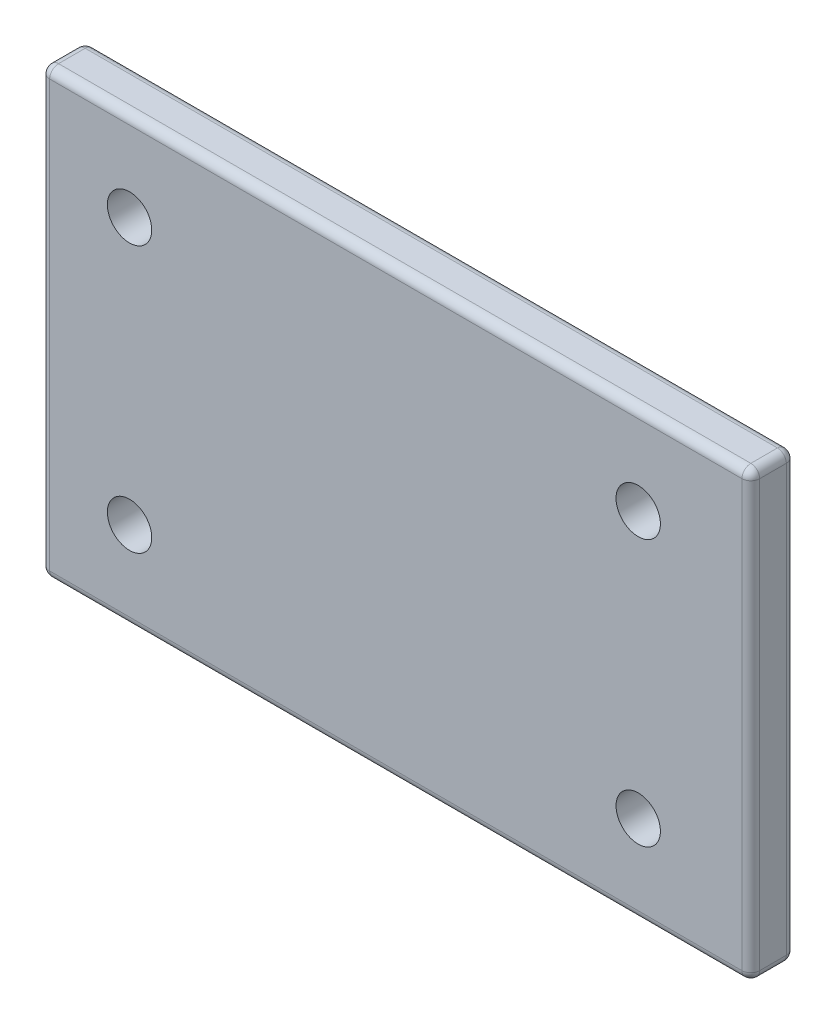
ISO-10303-21;
HEADER;
FILE_DESCRIPTION(('STEP AP214'),'2;1');
FILE_NAME('part.step','',(''),(''),'','','');
FILE_SCHEMA(('AUTOMOTIVE_DESIGN { 1 0 10303 214 1 1 1 1 }'));
ENDSEC;
DATA;
#1=APPLICATION_CONTEXT('core data for automotive mechanical design processes');
#2=APPLICATION_PROTOCOL_DEFINITION('international standard','automotive_design',2000,#1);
#3=PRODUCT_CONTEXT('',#1,'mechanical');
#4=PRODUCT('Part','Part','',(#3));
#5=PRODUCT_RELATED_PRODUCT_CATEGORY('part','',(#4));
#6=PRODUCT_DEFINITION_FORMATION('','',#4);
#7=PRODUCT_DEFINITION_CONTEXT('part definition',#1,'design');
#8=PRODUCT_DEFINITION('design','',#6,#7);
#9=PRODUCT_DEFINITION_SHAPE('','',#8);
#10=(LENGTH_UNIT() NAMED_UNIT(*) SI_UNIT(.MILLI.,.METRE.));
#11=(NAMED_UNIT(*) PLANE_ANGLE_UNIT() SI_UNIT($,.RADIAN.));
#12=(NAMED_UNIT(*) SI_UNIT($,.STERADIAN.) SOLID_ANGLE_UNIT());
#13=UNCERTAINTY_MEASURE_WITH_UNIT(LENGTH_MEASURE(1.E-05),#10,'distance_accuracy_value','');
#14=(GEOMETRIC_REPRESENTATION_CONTEXT(3) GLOBAL_UNCERTAINTY_ASSIGNED_CONTEXT((#13)) GLOBAL_UNIT_ASSIGNED_CONTEXT((#10,
#11,#12)) REPRESENTATION_CONTEXT('',''));
#15=CARTESIAN_POINT('',(0.,0.,0.));
#16=DIRECTION('',(0.,0.,1.));
#17=DIRECTION('',(1.,0.,0.));
#18=AXIS2_PLACEMENT_3D('',#15,#16,#17);
#19=CARTESIAN_POINT('',(-80.,-50.,10.));
#20=DIRECTION('',(1.,0.,0.));
#21=DIRECTION('',(0.,0.,-1.));
#22=AXIS2_PLACEMENT_3D('',#19,#20,#21);
#23=PLANE('',#22);
#24=DIRECTION('',(0.,0.,-1.));
#25=VECTOR('',#24,1.);
#26=CARTESIAN_POINT('',(-80.,48.,10.));
#27=LINE('',#26,#25);
#28=CARTESIAN_POINT('',(-80.,48.,8.));
#29=VERTEX_POINT('',#28);
#30=CARTESIAN_POINT('',(-80.,48.,2.));
#31=VERTEX_POINT('',#30);
#32=EDGE_CURVE('E179',#29,#31,#27,.T.);
#33=ORIENTED_EDGE('',*,*,#32,.T.);
#34=DIRECTION('',(0.,-1.,0.));
#35=VECTOR('',#34,1.);
#36=CARTESIAN_POINT('',(-80.,-50.,2.));
#37=LINE('',#36,#35);
#38=CARTESIAN_POINT('',(-80.,-48.,2.));
#39=VERTEX_POINT('',#38);
#40=EDGE_CURVE('E11',#31,#39,#37,.T.);
#41=ORIENTED_EDGE('',*,*,#40,.T.);
#42=DIRECTION('',(0.,0.,-1.));
#43=VECTOR('',#42,1.);
#44=CARTESIAN_POINT('',(-80.,-48.,10.));
#45=LINE('',#44,#43);
#46=CARTESIAN_POINT('',(-80.,-48.,8.));
#47=VERTEX_POINT('',#46);
#48=EDGE_CURVE('E212',#39,#47,#45,.F.);
#49=ORIENTED_EDGE('',*,*,#48,.T.);
#50=DIRECTION('',(0.,-1.,0.));
#51=VECTOR('',#50,1.);
#52=CARTESIAN_POINT('',(-80.,50.,8.));
#53=LINE('',#52,#51);
#54=EDGE_CURVE('E177',#47,#29,#53,.F.);
#55=ORIENTED_EDGE('',*,*,#54,.T.);
#56=EDGE_LOOP('',(#33,#41,#49,#55));
#57=FACE_BOUND('',#56,.T.);
#58=ADVANCED_FACE('F41',(#57),#23,.F.);
#59=CARTESIAN_POINT('',(80.,-50.,10.));
#60=DIRECTION('',(0.,1.,0.));
#61=DIRECTION('',(-1.,0.,0.));
#62=AXIS2_PLACEMENT_3D('',#59,#60,#61);
#63=PLANE('',#62);
#64=DIRECTION('',(1.,0.,0.));
#65=VECTOR('',#64,1.);
#66=CARTESIAN_POINT('',(-78.,-50.,8.));
#67=LINE('',#66,#65);
#68=CARTESIAN_POINT('',(78.,-50.,8.));
#69=VERTEX_POINT('',#68);
#70=CARTESIAN_POINT('',(-78.,-50.,8.));
#71=VERTEX_POINT('',#70);
#72=EDGE_CURVE('E198',#69,#71,#67,.F.);
#73=ORIENTED_EDGE('',*,*,#72,.T.);
#74=DIRECTION('',(0.,0.,-1.));
#75=VECTOR('',#74,1.);
#76=CARTESIAN_POINT('',(-78.,-50.,10.));
#77=LINE('',#76,#75);
#78=CARTESIAN_POINT('',(-78.,-50.,2.));
#79=VERTEX_POINT('',#78);
#80=EDGE_CURVE('E209',#71,#79,#77,.T.);
#81=ORIENTED_EDGE('',*,*,#80,.T.);
#82=DIRECTION('',(1.,0.,0.));
#83=VECTOR('',#82,1.);
#84=CARTESIAN_POINT('',(80.,-50.,2.));
#85=LINE('',#84,#83);
#86=CARTESIAN_POINT('',(78.,-50.,2.));
#87=VERTEX_POINT('',#86);
#88=EDGE_CURVE('E207',#79,#87,#85,.T.);
#89=ORIENTED_EDGE('',*,*,#88,.T.);
#90=DIRECTION('',(0.,0.,-1.));
#91=VECTOR('',#90,1.);
#92=CARTESIAN_POINT('',(78.,-50.,10.));
#93=LINE('',#92,#91);
#94=EDGE_CURVE('E205',#87,#69,#93,.F.);
#95=ORIENTED_EDGE('',*,*,#94,.T.);
#96=EDGE_LOOP('',(#73,#81,#89,#95));
#97=FACE_BOUND('',#96,.T.);
#98=ADVANCED_FACE('F286',(#97),#63,.F.);
#99=CARTESIAN_POINT('',(80.,-50.,10.));
#100=DIRECTION('',(-1.,0.,0.));
#101=DIRECTION('',(0.,0.,1.));
#102=AXIS2_PLACEMENT_3D('',#99,#100,#101);
#103=PLANE('',#102);
#104=DIRECTION('',(0.,1.,0.));
#105=VECTOR('',#104,1.);
#106=CARTESIAN_POINT('',(80.,-50.,8.));
#107=LINE('',#106,#105);
#108=CARTESIAN_POINT('',(80.,48.,8.));
#109=VERTEX_POINT('',#108);
#110=CARTESIAN_POINT('',(80.,-48.,8.));
#111=VERTEX_POINT('',#110);
#112=EDGE_CURVE('E184',#109,#111,#107,.F.);
#113=ORIENTED_EDGE('',*,*,#112,.T.);
#114=DIRECTION('',(0.,0.,-1.));
#115=VECTOR('',#114,1.);
#116=CARTESIAN_POINT('',(80.,-48.,10.));
#117=LINE('',#116,#115);
#118=CARTESIAN_POINT('',(80.,-48.,2.));
#119=VERTEX_POINT('',#118);
#120=EDGE_CURVE('E223',#111,#119,#117,.T.);
#121=ORIENTED_EDGE('',*,*,#120,.T.);
#122=DIRECTION('',(0.,1.,0.));
#123=VECTOR('',#122,1.);
#124=CARTESIAN_POINT('',(80.,-50.,2.));
#125=LINE('',#124,#123);
#126=CARTESIAN_POINT('',(80.,48.,2.));
#127=VERTEX_POINT('',#126);
#128=EDGE_CURVE('E189',#119,#127,#125,.T.);
#129=ORIENTED_EDGE('',*,*,#128,.T.);
#130=DIRECTION('',(0.,0.,-1.));
#131=VECTOR('',#130,1.);
#132=CARTESIAN_POINT('',(80.,48.,10.));
#133=LINE('',#132,#131);
#134=EDGE_CURVE('E187',#127,#109,#133,.F.);
#135=ORIENTED_EDGE('',*,*,#134,.T.);
#136=EDGE_LOOP('',(#113,#121,#129,#135));
#137=FACE_BOUND('',#136,.T.);
#138=ADVANCED_FACE('F320',(#137),#103,.F.);
#139=CARTESIAN_POINT('',(80.,50.,10.));
#140=DIRECTION('',(0.,-1.,0.));
#141=DIRECTION('',(1.,0.,0.));
#142=AXIS2_PLACEMENT_3D('',#139,#140,#141);
#143=PLANE('',#142);
#144=DIRECTION('',(0.,0.,-1.));
#145=VECTOR('',#144,1.);
#146=CARTESIAN_POINT('',(78.,50.,10.));
#147=LINE('',#146,#145);
#148=CARTESIAN_POINT('',(78.,50.,8.));
#149=VERTEX_POINT('',#148);
#150=CARTESIAN_POINT('',(78.,50.,2.));
#151=VERTEX_POINT('',#150);
#152=EDGE_CURVE('E194',#149,#151,#147,.T.);
#153=ORIENTED_EDGE('',*,*,#152,.T.);
#154=DIRECTION('',(-1.,0.,0.));
#155=VECTOR('',#154,1.);
#156=CARTESIAN_POINT('',(80.,50.,2.));
#157=LINE('',#156,#155);
#158=CARTESIAN_POINT('',(-78.,50.,2.));
#159=VERTEX_POINT('',#158);
#160=EDGE_CURVE('E249',#151,#159,#157,.T.);
#161=ORIENTED_EDGE('',*,*,#160,.T.);
#162=DIRECTION('',(0.,0.,-1.));
#163=VECTOR('',#162,1.);
#164=CARTESIAN_POINT('',(-78.,50.,10.));
#165=LINE('',#164,#163);
#166=CARTESIAN_POINT('',(-78.,50.,8.));
#167=VERTEX_POINT('',#166);
#168=EDGE_CURVE('E143',#159,#167,#165,.F.);
#169=ORIENTED_EDGE('',*,*,#168,.T.);
#170=DIRECTION('',(-1.,0.,0.));
#171=VECTOR('',#170,1.);
#172=CARTESIAN_POINT('',(80.,50.,8.));
#173=LINE('',#172,#171);
#174=EDGE_CURVE('E151',#167,#149,#173,.F.);
#175=ORIENTED_EDGE('',*,*,#174,.T.);
#176=EDGE_LOOP('',(#153,#161,#169,#175));
#177=FACE_BOUND('',#176,.T.);
#178=ADVANCED_FACE('F318',(#177),#143,.F.);
#179=CARTESIAN_POINT('',(0.,0.,10.));
#180=DIRECTION('',(0.,0.,1.));
#181=DIRECTION('',(1.,0.,0.));
#182=AXIS2_PLACEMENT_3D('',#179,#180,#181);
#183=PLANE('',#182);
#184=CARTESIAN_POINT('',(-60.,-30.,10.));
#185=DIRECTION('',(0.,0.,1.));
#186=DIRECTION('',(-1.,0.,0.));
#187=AXIS2_PLACEMENT_3D('',#184,#185,#186);
#188=CIRCLE('',#187,5.);
#189=CARTESIAN_POINT('',(-65.,-30.,10.));
#190=VERTEX_POINT('',#189);
#191=EDGE_CURVE('E577',#190,#190,#188,.T.);
#192=ORIENTED_EDGE('',*,*,#191,.F.);
#193=EDGE_LOOP('',(#192));
#194=FACE_BOUND('',#193,.T.);
#195=CARTESIAN_POINT('',(54.6247616156238,-30.,10.));
#196=DIRECTION('',(0.,0.,1.));
#197=DIRECTION('',(1.,0.,0.));
#198=AXIS2_PLACEMENT_3D('',#195,#196,#197);
#199=CIRCLE('',#198,5.);
#200=CARTESIAN_POINT('',(59.6247616156238,-30.,10.));
#201=VERTEX_POINT('',#200);
#202=EDGE_CURVE('E581',#201,#201,#199,.T.);
#203=ORIENTED_EDGE('',*,*,#202,.F.);
#204=EDGE_LOOP('',(#203));
#205=FACE_BOUND('',#204,.T.);
#206=CARTESIAN_POINT('',(54.6247616156238,30.,10.));
#207=DIRECTION('',(0.,0.,1.));
#208=DIRECTION('',(-1.,0.,0.));
#209=AXIS2_PLACEMENT_3D('',#206,#207,#208);
#210=CIRCLE('',#209,5.00000000000001);
#211=CARTESIAN_POINT('',(49.6247616156238,30.,10.));
#212=VERTEX_POINT('',#211);
#213=EDGE_CURVE('E590',#212,#212,#210,.T.);
#214=ORIENTED_EDGE('',*,*,#213,.F.);
#215=EDGE_LOOP('',(#214));
#216=FACE_BOUND('',#215,.T.);
#217=CARTESIAN_POINT('',(-60.,30.,10.));
#218=DIRECTION('',(0.,0.,1.));
#219=DIRECTION('',(1.,0.,0.));
#220=AXIS2_PLACEMENT_3D('',#217,#218,#219);
#221=CIRCLE('',#220,5.00000000000001);
#222=CARTESIAN_POINT('',(-55.,30.,10.));
#223=VERTEX_POINT('',#222);
#224=EDGE_CURVE('E171',#223,#223,#221,.T.);
#225=ORIENTED_EDGE('',*,*,#224,.F.);
#226=EDGE_LOOP('',(#225));
#227=FACE_BOUND('',#226,.T.);
#228=DIRECTION('',(0.,-1.,0.));
#229=VECTOR('',#228,1.);
#230=CARTESIAN_POINT('',(-78.,-50.,10.));
#231=LINE('',#230,#229);
#232=CARTESIAN_POINT('',(-78.,48.,10.));
#233=VERTEX_POINT('',#232);
#234=CARTESIAN_POINT('',(-78.,-48.,10.));
#235=VERTEX_POINT('',#234);
#236=EDGE_CURVE('E136',#233,#235,#231,.T.);
#237=ORIENTED_EDGE('',*,*,#236,.T.);
#238=DIRECTION('',(1.,0.,0.));
#239=VECTOR('',#238,1.);
#240=CARTESIAN_POINT('',(78.,-48.,10.));
#241=LINE('',#240,#239);
#242=CARTESIAN_POINT('',(78.,-48.,10.));
#243=VERTEX_POINT('',#242);
#244=EDGE_CURVE('E225',#235,#243,#241,.T.);
#245=ORIENTED_EDGE('',*,*,#244,.T.);
#246=DIRECTION('',(0.,1.,0.));
#247=VECTOR('',#246,1.);
#248=CARTESIAN_POINT('',(78.,48.,10.));
#249=LINE('',#248,#247);
#250=CARTESIAN_POINT('',(78.,48.,10.));
#251=VERTEX_POINT('',#250);
#252=EDGE_CURVE('E139',#243,#251,#249,.T.);
#253=ORIENTED_EDGE('',*,*,#252,.T.);
#254=DIRECTION('',(-1.,0.,0.));
#255=VECTOR('',#254,1.);
#256=CARTESIAN_POINT('',(-80.,48.,10.));
#257=LINE('',#256,#255);
#258=EDGE_CURVE('E132',#251,#233,#257,.T.);
#259=ORIENTED_EDGE('',*,*,#258,.T.);
#260=EDGE_LOOP('',(#237,#245,#253,#259));
#261=FACE_BOUND('',#260,.T.);
#262=ADVANCED_FACE('F134',(#194,#205,#216,#227,#261),#183,.T.);
#263=CARTESIAN_POINT('',(0.,0.,0.));
#264=DIRECTION('',(0.,0.,1.));
#265=DIRECTION('',(1.,0.,0.));
#266=AXIS2_PLACEMENT_3D('',#263,#264,#265);
#267=PLANE('',#266);
#268=CARTESIAN_POINT('',(-60.,-30.,0.));
#269=DIRECTION('',(0.,0.,1.));
#270=DIRECTION('',(-1.,0.,0.));
#271=AXIS2_PLACEMENT_3D('',#268,#269,#270);
#272=CIRCLE('',#271,5.);
#273=CARTESIAN_POINT('',(-65.,-30.,0.));
#274=VERTEX_POINT('',#273);
#275=EDGE_CURVE('E163',#274,#274,#272,.T.);
#276=ORIENTED_EDGE('',*,*,#275,.T.);
#277=EDGE_LOOP('',(#276));
#278=FACE_BOUND('',#277,.T.);
#279=CARTESIAN_POINT('',(54.6247616156238,-30.,0.));
#280=DIRECTION('',(0.,0.,1.));
#281=DIRECTION('',(1.,0.,0.));
#282=AXIS2_PLACEMENT_3D('',#279,#280,#281);
#283=CIRCLE('',#282,5.);
#284=CARTESIAN_POINT('',(59.6247616156238,-30.,0.));
#285=VERTEX_POINT('',#284);
#286=EDGE_CURVE('E578',#285,#285,#283,.T.);
#287=ORIENTED_EDGE('',*,*,#286,.T.);
#288=EDGE_LOOP('',(#287));
#289=FACE_BOUND('',#288,.T.);
#290=CARTESIAN_POINT('',(54.6247616156238,30.,0.));
#291=DIRECTION('',(0.,0.,1.));
#292=DIRECTION('',(-1.,0.,0.));
#293=AXIS2_PLACEMENT_3D('',#290,#291,#292);
#294=CIRCLE('',#293,5.00000000000001);
#295=CARTESIAN_POINT('',(49.6247616156238,30.,0.));
#296=VERTEX_POINT('',#295);
#297=EDGE_CURVE('E587',#296,#296,#294,.T.);
#298=ORIENTED_EDGE('',*,*,#297,.T.);
#299=EDGE_LOOP('',(#298));
#300=FACE_BOUND('',#299,.T.);
#301=CARTESIAN_POINT('',(-60.,30.,0.));
#302=DIRECTION('',(0.,0.,1.));
#303=DIRECTION('',(1.,0.,0.));
#304=AXIS2_PLACEMENT_3D('',#301,#302,#303);
#305=CIRCLE('',#304,5.00000000000001);
#306=CARTESIAN_POINT('',(-55.,30.,0.));
#307=VERTEX_POINT('',#306);
#308=EDGE_CURVE('E168',#307,#307,#305,.T.);
#309=ORIENTED_EDGE('',*,*,#308,.T.);
#310=EDGE_LOOP('',(#309));
#311=FACE_BOUND('',#310,.T.);
#312=DIRECTION('',(0.,-1.,0.));
#313=VECTOR('',#312,1.);
#314=CARTESIAN_POINT('',(-78.,0.,0.));
#315=LINE('',#314,#313);
#316=CARTESIAN_POINT('',(-78.,-48.,0.));
#317=VERTEX_POINT('',#316);
#318=CARTESIAN_POINT('',(-78.,48.,0.));
#319=VERTEX_POINT('',#318);
#320=EDGE_CURVE('E251',#317,#319,#315,.F.);
#321=ORIENTED_EDGE('',*,*,#320,.T.);
#322=DIRECTION('',(-1.,0.,0.));
#323=VECTOR('',#322,1.);
#324=CARTESIAN_POINT('',(0.,48.,0.));
#325=LINE('',#324,#323);
#326=CARTESIAN_POINT('',(78.,48.,0.));
#327=VERTEX_POINT('',#326);
#328=EDGE_CURVE('E253',#319,#327,#325,.F.);
#329=ORIENTED_EDGE('',*,*,#328,.T.);
#330=DIRECTION('',(0.,1.,0.));
#331=VECTOR('',#330,1.);
#332=CARTESIAN_POINT('',(78.,0.,0.));
#333=LINE('',#332,#331);
#334=CARTESIAN_POINT('',(78.,-48.,0.));
#335=VERTEX_POINT('',#334);
#336=EDGE_CURVE('E192',#327,#335,#333,.F.);
#337=ORIENTED_EDGE('',*,*,#336,.T.);
#338=DIRECTION('',(1.,0.,0.));
#339=VECTOR('',#338,1.);
#340=CARTESIAN_POINT('',(0.,-48.,0.));
#341=LINE('',#340,#339);
#342=EDGE_CURVE('E220',#335,#317,#341,.F.);
#343=ORIENTED_EDGE('',*,*,#342,.T.);
#344=EDGE_LOOP('',(#321,#329,#337,#343));
#345=FACE_BOUND('',#344,.T.);
#346=ADVANCED_FACE('F304',(#278,#289,#300,#311,#345),#267,.F.);
#347=CARTESIAN_POINT('',(-60.,30.,0.));
#348=DIRECTION('',(0.,0.,1.));
#349=DIRECTION('',(1.,0.,0.));
#350=AXIS2_PLACEMENT_3D('',#347,#348,#349);
#351=CYLINDRICAL_SURFACE('',#350,5.00000000000001);
#352=ORIENTED_EDGE('',*,*,#308,.F.);
#353=EDGE_LOOP('',(#352));
#354=FACE_BOUND('',#353,.T.);
#355=ORIENTED_EDGE('',*,*,#224,.T.);
#356=EDGE_LOOP('',(#355));
#357=FACE_BOUND('',#356,.T.);
#358=ADVANCED_FACE('F426',(#354,#357),#351,.F.);
#359=CARTESIAN_POINT('',(54.6247616156238,30.,0.));
#360=DIRECTION('',(0.,0.,1.));
#361=DIRECTION('',(1.,0.,0.));
#362=AXIS2_PLACEMENT_3D('',#359,#360,#361);
#363=CYLINDRICAL_SURFACE('',#362,5.00000000000001);
#364=ORIENTED_EDGE('',*,*,#297,.F.);
#365=EDGE_LOOP('',(#364));
#366=FACE_BOUND('',#365,.T.);
#367=ORIENTED_EDGE('',*,*,#213,.T.);
#368=EDGE_LOOP('',(#367));
#369=FACE_BOUND('',#368,.T.);
#370=ADVANCED_FACE('F442',(#366,#369),#363,.F.);
#371=CARTESIAN_POINT('',(54.6247616156238,-30.,0.));
#372=DIRECTION('',(0.,0.,1.));
#373=DIRECTION('',(1.,0.,0.));
#374=AXIS2_PLACEMENT_3D('',#371,#372,#373);
#375=CYLINDRICAL_SURFACE('',#374,5.);
#376=ORIENTED_EDGE('',*,*,#286,.F.);
#377=EDGE_LOOP('',(#376));
#378=FACE_BOUND('',#377,.T.);
#379=ORIENTED_EDGE('',*,*,#202,.T.);
#380=EDGE_LOOP('',(#379));
#381=FACE_BOUND('',#380,.T.);
#382=ADVANCED_FACE('F452',(#378,#381),#375,.F.);
#383=CARTESIAN_POINT('',(-60.,-30.,0.));
#384=DIRECTION('',(0.,0.,1.));
#385=DIRECTION('',(1.,0.,0.));
#386=AXIS2_PLACEMENT_3D('',#383,#384,#385);
#387=CYLINDRICAL_SURFACE('',#386,5.);
#388=ORIENTED_EDGE('',*,*,#275,.F.);
#389=EDGE_LOOP('',(#388));
#390=FACE_BOUND('',#389,.T.);
#391=ORIENTED_EDGE('',*,*,#191,.T.);
#392=EDGE_LOOP('',(#391));
#393=FACE_BOUND('',#392,.T.);
#394=ADVANCED_FACE('F348',(#390,#393),#387,.F.);
#395=CARTESIAN_POINT('',(-78.,0.,8.));
#396=DIRECTION('',(0.,1.,0.));
#397=DIRECTION('',(0.,0.,1.));
#398=AXIS2_PLACEMENT_3D('',#395,#396,#397);
#399=CYLINDRICAL_SURFACE('',#398,2.);
#400=ORIENTED_EDGE('',*,*,#54,.F.);
#401=CARTESIAN_POINT('',(-78.,-48.,8.));
#402=DIRECTION('',(0.,1.,0.));
#403=DIRECTION('',(0.,0.,1.));
#404=AXIS2_PLACEMENT_3D('',#401,#402,#403);
#405=CIRCLE('',#404,2.);
#406=EDGE_CURVE('E167',#47,#235,#405,.T.);
#407=ORIENTED_EDGE('',*,*,#406,.T.);
#408=ORIENTED_EDGE('',*,*,#236,.F.);
#409=CARTESIAN_POINT('',(-78.,48.,8.));
#410=DIRECTION('',(0.,1.,0.));
#411=DIRECTION('',(0.,0.,1.));
#412=AXIS2_PLACEMENT_3D('',#409,#410,#411);
#413=CIRCLE('',#412,2.);
#414=EDGE_CURVE('E158',#29,#233,#413,.T.);
#415=ORIENTED_EDGE('',*,*,#414,.F.);
#416=EDGE_LOOP('',(#400,#407,#408,#415));
#417=FACE_BOUND('',#416,.T.);
#418=ADVANCED_FACE('F165',(#417),#399,.T.);
#419=CARTESIAN_POINT('',(-78.,48.,10.));
#420=DIRECTION('',(0.,0.,-1.));
#421=DIRECTION('',(-1.,0.,0.));
#422=AXIS2_PLACEMENT_3D('',#419,#420,#421);
#423=CYLINDRICAL_SURFACE('',#422,2.);
#424=ORIENTED_EDGE('',*,*,#168,.F.);
#425=CARTESIAN_POINT('',(-78.,48.,2.));
#426=DIRECTION('',(0.,0.,-1.));
#427=DIRECTION('',(-1.,0.,0.));
#428=AXIS2_PLACEMENT_3D('',#425,#426,#427);
#429=CIRCLE('',#428,2.);
#430=EDGE_CURVE('E64',#159,#31,#429,.F.);
#431=ORIENTED_EDGE('',*,*,#430,.T.);
#432=ORIENTED_EDGE('',*,*,#32,.F.);
#433=CARTESIAN_POINT('',(-78.,48.,8.));
#434=DIRECTION('',(0.,0.,1.));
#435=DIRECTION('',(1.,0.,0.));
#436=AXIS2_PLACEMENT_3D('',#433,#434,#435);
#437=CIRCLE('',#436,2.);
#438=EDGE_CURVE('E154',#167,#29,#437,.T.);
#439=ORIENTED_EDGE('',*,*,#438,.F.);
#440=EDGE_LOOP('',(#424,#431,#432,#439));
#441=FACE_BOUND('',#440,.T.);
#442=ADVANCED_FACE('F294',(#441),#423,.T.);
#443=CARTESIAN_POINT('',(-78.,48.,8.));
#444=DIRECTION('',(-1.,0.,0.));
#445=DIRECTION('',(0.,-1.,0.));
#446=AXIS2_PLACEMENT_3D('',#443,#444,#445);
#447=SPHERICAL_SURFACE('',#446,2.);
#448=ORIENTED_EDGE('',*,*,#438,.T.);
#449=ORIENTED_EDGE('',*,*,#414,.T.);
#450=CARTESIAN_POINT('',(-78.,48.,8.));
#451=DIRECTION('',(-1.,0.,0.));
#452=DIRECTION('',(0.,0.,1.));
#453=AXIS2_PLACEMENT_3D('',#450,#451,#452);
#454=CIRCLE('',#453,2.);
#455=EDGE_CURVE('E147',#167,#233,#454,.F.);
#456=ORIENTED_EDGE('',*,*,#455,.F.);
#457=EDGE_LOOP('',(#448,#449,#456));
#458=FACE_BOUND('',#457,.T.);
#459=ADVANCED_FACE('F159',(#458),#447,.T.);
#460=CARTESIAN_POINT('',(0.,48.,8.));
#461=DIRECTION('',(1.,0.,0.));
#462=DIRECTION('',(0.,1.,0.));
#463=AXIS2_PLACEMENT_3D('',#460,#461,#462);
#464=CYLINDRICAL_SURFACE('',#463,2.);
#465=ORIENTED_EDGE('',*,*,#258,.F.);
#466=CARTESIAN_POINT('',(78.,48.,8.));
#467=DIRECTION('',(1.,0.,0.));
#468=DIRECTION('',(0.,1.,0.));
#469=AXIS2_PLACEMENT_3D('',#466,#467,#468);
#470=CIRCLE('',#469,2.);
#471=EDGE_CURVE('E180',#251,#149,#470,.F.);
#472=ORIENTED_EDGE('',*,*,#471,.T.);
#473=ORIENTED_EDGE('',*,*,#174,.F.);
#474=ORIENTED_EDGE('',*,*,#455,.T.);
#475=EDGE_LOOP('',(#465,#472,#473,#474));
#476=FACE_BOUND('',#475,.T.);
#477=ADVANCED_FACE('F149',(#476),#464,.T.);
#478=CARTESIAN_POINT('',(78.,-50.,2.));
#479=DIRECTION('',(0.,1.,0.));
#480=DIRECTION('',(0.,0.,1.));
#481=AXIS2_PLACEMENT_3D('',#478,#479,#480);
#482=CYLINDRICAL_SURFACE('',#481,2.);
#483=ORIENTED_EDGE('',*,*,#336,.F.);
#484=CARTESIAN_POINT('',(78.,48.,2.));
#485=DIRECTION('',(0.,1.,0.));
#486=DIRECTION('',(0.,0.,1.));
#487=AXIS2_PLACEMENT_3D('',#484,#485,#486);
#488=CIRCLE('',#487,2.);
#489=EDGE_CURVE('E247',#327,#127,#488,.F.);
#490=ORIENTED_EDGE('',*,*,#489,.T.);
#491=ORIENTED_EDGE('',*,*,#128,.F.);
#492=CARTESIAN_POINT('',(78.,-48.,2.));
#493=DIRECTION('',(0.,1.,0.));
#494=DIRECTION('',(0.,0.,1.));
#495=AXIS2_PLACEMENT_3D('',#492,#493,#494);
#496=CIRCLE('',#495,2.);
#497=EDGE_CURVE('E215',#119,#335,#496,.T.);
#498=ORIENTED_EDGE('',*,*,#497,.T.);
#499=EDGE_LOOP('',(#483,#490,#491,#498));
#500=FACE_BOUND('',#499,.T.);
#501=ADVANCED_FACE('F307',(#500),#482,.T.);
#502=CARTESIAN_POINT('',(78.,48.,10.));
#503=DIRECTION('',(0.,0.,-1.));
#504=DIRECTION('',(-1.,0.,0.));
#505=AXIS2_PLACEMENT_3D('',#502,#503,#504);
#506=CYLINDRICAL_SURFACE('',#505,2.);
#507=ORIENTED_EDGE('',*,*,#134,.F.);
#508=CARTESIAN_POINT('',(78.,48.,2.));
#509=DIRECTION('',(0.,0.,-1.));
#510=DIRECTION('',(-1.,0.,0.));
#511=AXIS2_PLACEMENT_3D('',#508,#509,#510);
#512=CIRCLE('',#511,2.);
#513=EDGE_CURVE('E227',#127,#151,#512,.F.);
#514=ORIENTED_EDGE('',*,*,#513,.T.);
#515=ORIENTED_EDGE('',*,*,#152,.F.);
#516=CARTESIAN_POINT('',(78.,48.,8.));
#517=DIRECTION('',(0.,0.,1.));
#518=DIRECTION('',(1.,0.,0.));
#519=AXIS2_PLACEMENT_3D('',#516,#517,#518);
#520=CIRCLE('',#519,2.);
#521=EDGE_CURVE('E155',#109,#149,#520,.T.);
#522=ORIENTED_EDGE('',*,*,#521,.F.);
#523=EDGE_LOOP('',(#507,#514,#515,#522));
#524=FACE_BOUND('',#523,.T.);
#525=ADVANCED_FACE('F316',(#524),#506,.T.);
#526=CARTESIAN_POINT('',(78.,0.,8.));
#527=DIRECTION('',(0.,-1.,0.));
#528=DIRECTION('',(0.,0.,-1.));
#529=AXIS2_PLACEMENT_3D('',#526,#527,#528);
#530=CYLINDRICAL_SURFACE('',#529,2.);
#531=ORIENTED_EDGE('',*,*,#252,.F.);
#532=CARTESIAN_POINT('',(78.,-48.,8.));
#533=DIRECTION('',(0.,-1.,0.));
#534=DIRECTION('',(0.,0.,-1.));
#535=AXIS2_PLACEMENT_3D('',#532,#533,#534);
#536=CIRCLE('',#535,2.);
#537=EDGE_CURVE('E218',#243,#111,#536,.F.);
#538=ORIENTED_EDGE('',*,*,#537,.T.);
#539=ORIENTED_EDGE('',*,*,#112,.F.);
#540=CARTESIAN_POINT('',(78.,48.,8.));
#541=DIRECTION('',(0.,1.,0.));
#542=DIRECTION('',(0.,0.,1.));
#543=AXIS2_PLACEMENT_3D('',#540,#541,#542);
#544=CIRCLE('',#543,2.);
#545=EDGE_CURVE('E199',#251,#109,#544,.T.);
#546=ORIENTED_EDGE('',*,*,#545,.F.);
#547=EDGE_LOOP('',(#531,#538,#539,#546));
#548=FACE_BOUND('',#547,.T.);
#549=ADVANCED_FACE('F353',(#548),#530,.T.);
#550=CARTESIAN_POINT('',(78.,48.,8.));
#551=DIRECTION('',(-1.,0.,0.));
#552=DIRECTION('',(0.,0.,1.));
#553=AXIS2_PLACEMENT_3D('',#550,#551,#552);
#554=SPHERICAL_SURFACE('',#553,2.);
#555=ORIENTED_EDGE('',*,*,#521,.T.);
#556=ORIENTED_EDGE('',*,*,#471,.F.);
#557=ORIENTED_EDGE('',*,*,#545,.T.);
#558=EDGE_LOOP('',(#555,#556,#557));
#559=FACE_BOUND('',#558,.T.);
#560=ADVANCED_FACE('F349',(#559),#554,.T.);
#561=CARTESIAN_POINT('',(78.,-48.,8.));
#562=DIRECTION('',(0.,1.,0.));
#563=DIRECTION('',(-1.,0.,0.));
#564=AXIS2_PLACEMENT_3D('',#561,#562,#563);
#565=SPHERICAL_SURFACE('',#564,2.);
#566=CARTESIAN_POINT('',(78.,-48.,8.));
#567=DIRECTION('',(-1.,0.,0.));
#568=DIRECTION('',(0.,0.,1.));
#569=AXIS2_PLACEMENT_3D('',#566,#567,#568);
#570=CIRCLE('',#569,2.);
#571=EDGE_CURVE('E240',#69,#243,#570,.T.);
#572=ORIENTED_EDGE('',*,*,#571,.F.);
#573=CARTESIAN_POINT('',(78.,-48.,8.));
#574=DIRECTION('',(0.,0.,-1.));
#575=DIRECTION('',(-1.,0.,0.));
#576=AXIS2_PLACEMENT_3D('',#573,#574,#575);
#577=CIRCLE('',#576,2.);
#578=EDGE_CURVE('E202',#111,#69,#577,.T.);
#579=ORIENTED_EDGE('',*,*,#578,.F.);
#580=ORIENTED_EDGE('',*,*,#537,.F.);
#581=EDGE_LOOP('',(#572,#579,#580));
#582=FACE_BOUND('',#581,.T.);
#583=ADVANCED_FACE('F352',(#582),#565,.T.);
#584=CARTESIAN_POINT('',(78.,-48.,10.));
#585=DIRECTION('',(0.,0.,-1.));
#586=DIRECTION('',(-1.,0.,0.));
#587=AXIS2_PLACEMENT_3D('',#584,#585,#586);
#588=CYLINDRICAL_SURFACE('',#587,2.);
#589=ORIENTED_EDGE('',*,*,#578,.T.);
#590=ORIENTED_EDGE('',*,*,#94,.F.);
#591=CARTESIAN_POINT('',(78.,-48.,2.));
#592=DIRECTION('',(0.,0.,-1.));
#593=DIRECTION('',(-1.,0.,0.));
#594=AXIS2_PLACEMENT_3D('',#591,#592,#593);
#595=CIRCLE('',#594,2.);
#596=EDGE_CURVE('E237',#119,#87,#595,.T.);
#597=ORIENTED_EDGE('',*,*,#596,.F.);
#598=ORIENTED_EDGE('',*,*,#120,.F.);
#599=EDGE_LOOP('',(#589,#590,#597,#598));
#600=FACE_BOUND('',#599,.T.);
#601=ADVANCED_FACE('F373',(#600),#588,.T.);
#602=CARTESIAN_POINT('',(0.,-48.,8.));
#603=DIRECTION('',(-1.,0.,0.));
#604=DIRECTION('',(0.,-1.,0.));
#605=AXIS2_PLACEMENT_3D('',#602,#603,#604);
#606=CYLINDRICAL_SURFACE('',#605,2.);
#607=ORIENTED_EDGE('',*,*,#571,.T.);
#608=ORIENTED_EDGE('',*,*,#244,.F.);
#609=CARTESIAN_POINT('',(-78.,-48.,8.));
#610=DIRECTION('',(-1.,0.,0.));
#611=DIRECTION('',(0.,0.,1.));
#612=AXIS2_PLACEMENT_3D('',#609,#610,#611);
#613=CIRCLE('',#612,2.);
#614=EDGE_CURVE('E234',#71,#235,#613,.T.);
#615=ORIENTED_EDGE('',*,*,#614,.F.);
#616=ORIENTED_EDGE('',*,*,#72,.F.);
#617=EDGE_LOOP('',(#607,#608,#615,#616));
#618=FACE_BOUND('',#617,.T.);
#619=ADVANCED_FACE('F291',(#618),#606,.T.);
#620=CARTESIAN_POINT('',(78.,-48.,2.));
#621=DIRECTION('',(0.,1.,0.));
#622=DIRECTION('',(-1.,0.,0.));
#623=AXIS2_PLACEMENT_3D('',#620,#621,#622);
#624=SPHERICAL_SURFACE('',#623,2.);
#625=ORIENTED_EDGE('',*,*,#497,.F.);
#626=ORIENTED_EDGE('',*,*,#596,.T.);
#627=CARTESIAN_POINT('',(78.,-48.,2.));
#628=DIRECTION('',(-1.,0.,0.));
#629=DIRECTION('',(0.,0.,1.));
#630=AXIS2_PLACEMENT_3D('',#627,#628,#629);
#631=CIRCLE('',#630,2.);
#632=EDGE_CURVE('E231',#335,#87,#631,.T.);
#633=ORIENTED_EDGE('',*,*,#632,.F.);
#634=EDGE_LOOP('',(#625,#626,#633));
#635=FACE_BOUND('',#634,.T.);
#636=ADVANCED_FACE('F367',(#635),#624,.T.);
#637=CARTESIAN_POINT('',(-78.,-48.,8.));
#638=DIRECTION('',(0.,1.,0.));
#639=DIRECTION('',(-1.,0.,0.));
#640=AXIS2_PLACEMENT_3D('',#637,#638,#639);
#641=SPHERICAL_SURFACE('',#640,2.);
#642=ORIENTED_EDGE('',*,*,#614,.T.);
#643=ORIENTED_EDGE('',*,*,#406,.F.);
#644=CARTESIAN_POINT('',(-78.,-48.,8.));
#645=DIRECTION('',(0.,0.,-1.));
#646=DIRECTION('',(-1.,0.,0.));
#647=AXIS2_PLACEMENT_3D('',#644,#645,#646);
#648=CIRCLE('',#647,2.);
#649=EDGE_CURVE('E228',#71,#47,#648,.T.);
#650=ORIENTED_EDGE('',*,*,#649,.F.);
#651=EDGE_LOOP('',(#642,#643,#650));
#652=FACE_BOUND('',#651,.T.);
#653=ADVANCED_FACE('F293',(#652),#641,.T.);
#654=CARTESIAN_POINT('',(80.,-48.,2.));
#655=DIRECTION('',(1.,0.,0.));
#656=DIRECTION('',(0.,1.,0.));
#657=AXIS2_PLACEMENT_3D('',#654,#655,#656);
#658=CYLINDRICAL_SURFACE('',#657,2.);
#659=ORIENTED_EDGE('',*,*,#88,.F.);
#660=CARTESIAN_POINT('',(-78.,-48.,2.));
#661=DIRECTION('',(1.,0.,0.));
#662=DIRECTION('',(0.,1.,0.));
#663=AXIS2_PLACEMENT_3D('',#660,#661,#662);
#664=CIRCLE('',#663,2.);
#665=EDGE_CURVE('E50',#79,#317,#664,.T.);
#666=ORIENTED_EDGE('',*,*,#665,.T.);
#667=ORIENTED_EDGE('',*,*,#342,.F.);
#668=ORIENTED_EDGE('',*,*,#632,.T.);
#669=EDGE_LOOP('',(#659,#666,#667,#668));
#670=FACE_BOUND('',#669,.T.);
#671=ADVANCED_FACE('F281',(#670),#658,.T.);
#672=CARTESIAN_POINT('',(-78.,-48.,10.));
#673=DIRECTION('',(0.,0.,-1.));
#674=DIRECTION('',(-1.,0.,0.));
#675=AXIS2_PLACEMENT_3D('',#672,#673,#674);
#676=CYLINDRICAL_SURFACE('',#675,2.);
#677=ORIENTED_EDGE('',*,*,#48,.F.);
#678=CARTESIAN_POINT('',(-78.,-48.,2.));
#679=DIRECTION('',(0.,0.,-1.));
#680=DIRECTION('',(-1.,0.,0.));
#681=AXIS2_PLACEMENT_3D('',#678,#679,#680);
#682=CIRCLE('',#681,2.);
#683=EDGE_CURVE('E256',#39,#79,#682,.F.);
#684=ORIENTED_EDGE('',*,*,#683,.T.);
#685=ORIENTED_EDGE('',*,*,#80,.F.);
#686=ORIENTED_EDGE('',*,*,#649,.T.);
#687=EDGE_LOOP('',(#677,#684,#685,#686));
#688=FACE_BOUND('',#687,.T.);
#689=ADVANCED_FACE('F279',(#688),#676,.T.);
#690=CARTESIAN_POINT('',(-78.,-48.,2.));
#691=DIRECTION('',(0.,0.,1.));
#692=DIRECTION('',(1.,0.,0.));
#693=AXIS2_PLACEMENT_3D('',#690,#691,#692);
#694=SPHERICAL_SURFACE('',#693,2.);
#695=ORIENTED_EDGE('',*,*,#665,.F.);
#696=ORIENTED_EDGE('',*,*,#683,.F.);
#697=CARTESIAN_POINT('',(-78.,-48.,2.));
#698=DIRECTION('',(0.,1.,0.));
#699=DIRECTION('',(0.,0.,1.));
#700=AXIS2_PLACEMENT_3D('',#697,#698,#699);
#701=CIRCLE('',#700,2.);
#702=EDGE_CURVE('E45',#317,#39,#701,.T.);
#703=ORIENTED_EDGE('',*,*,#702,.F.);
#704=EDGE_LOOP('',(#695,#696,#703));
#705=FACE_BOUND('',#704,.T.);
#706=ADVANCED_FACE('F43',(#705),#694,.T.);
#707=CARTESIAN_POINT('',(-78.,-50.,2.));
#708=DIRECTION('',(0.,-1.,0.));
#709=DIRECTION('',(0.,0.,-1.));
#710=AXIS2_PLACEMENT_3D('',#707,#708,#709);
#711=CYLINDRICAL_SURFACE('',#710,2.);
#712=ORIENTED_EDGE('',*,*,#702,.T.);
#713=ORIENTED_EDGE('',*,*,#40,.F.);
#714=CARTESIAN_POINT('',(-78.,48.,2.));
#715=DIRECTION('',(0.,1.,0.));
#716=DIRECTION('',(0.,0.,1.));
#717=AXIS2_PLACEMENT_3D('',#714,#715,#716);
#718=CIRCLE('',#717,2.);
#719=EDGE_CURVE('E263',#319,#31,#718,.T.);
#720=ORIENTED_EDGE('',*,*,#719,.F.);
#721=ORIENTED_EDGE('',*,*,#320,.F.);
#722=EDGE_LOOP('',(#712,#713,#720,#721));
#723=FACE_BOUND('',#722,.T.);
#724=ADVANCED_FACE('F272',(#723),#711,.T.);
#725=CARTESIAN_POINT('',(-78.,48.,2.));
#726=DIRECTION('',(0.,0.,1.));
#727=DIRECTION('',(1.,0.,0.));
#728=AXIS2_PLACEMENT_3D('',#725,#726,#727);
#729=SPHERICAL_SURFACE('',#728,2.);
#730=ORIENTED_EDGE('',*,*,#719,.T.);
#731=ORIENTED_EDGE('',*,*,#430,.F.);
#732=CARTESIAN_POINT('',(-78.,48.,2.));
#733=DIRECTION('',(1.,0.,0.));
#734=DIRECTION('',(0.,0.,-1.));
#735=AXIS2_PLACEMENT_3D('',#732,#733,#734);
#736=CIRCLE('',#735,2.);
#737=EDGE_CURVE('E261',#319,#159,#736,.T.);
#738=ORIENTED_EDGE('',*,*,#737,.F.);
#739=EDGE_LOOP('',(#730,#731,#738));
#740=FACE_BOUND('',#739,.T.);
#741=ADVANCED_FACE('F296',(#740),#729,.T.);
#742=CARTESIAN_POINT('',(80.,48.,2.));
#743=DIRECTION('',(-1.,0.,0.));
#744=DIRECTION('',(0.,-1.,0.));
#745=AXIS2_PLACEMENT_3D('',#742,#743,#744);
#746=CYLINDRICAL_SURFACE('',#745,2.);
#747=ORIENTED_EDGE('',*,*,#737,.T.);
#748=ORIENTED_EDGE('',*,*,#160,.F.);
#749=CARTESIAN_POINT('',(78.,48.,2.));
#750=DIRECTION('',(1.,0.,0.));
#751=DIRECTION('',(0.,0.,-1.));
#752=AXIS2_PLACEMENT_3D('',#749,#750,#751);
#753=CIRCLE('',#752,2.);
#754=EDGE_CURVE('E259',#327,#151,#753,.T.);
#755=ORIENTED_EDGE('',*,*,#754,.F.);
#756=ORIENTED_EDGE('',*,*,#328,.F.);
#757=EDGE_LOOP('',(#747,#748,#755,#756));
#758=FACE_BOUND('',#757,.T.);
#759=ADVANCED_FACE('F300',(#758),#746,.T.);
#760=CARTESIAN_POINT('',(78.,48.,2.));
#761=DIRECTION('',(0.,0.,1.));
#762=DIRECTION('',(1.,0.,0.));
#763=AXIS2_PLACEMENT_3D('',#760,#761,#762);
#764=SPHERICAL_SURFACE('',#763,2.);
#765=ORIENTED_EDGE('',*,*,#513,.F.);
#766=ORIENTED_EDGE('',*,*,#489,.F.);
#767=ORIENTED_EDGE('',*,*,#754,.T.);
#768=EDGE_LOOP('',(#765,#766,#767));
#769=FACE_BOUND('',#768,.T.);
#770=ADVANCED_FACE('F312',(#769),#764,.T.);
#771=CLOSED_SHELL('',(#58,#98,#138,#178,#262,#346,#358,#370,#382,#394,#418,#442,#459,#477,#501,
#525,#549,#560,#583,#601,#619,#636,#653,#671,#689,#706,#724,#741,#759,#770));
#772=MANIFOLD_SOLID_BREP('B2',#771);
#773=ADVANCED_BREP_SHAPE_REPRESENTATION('',(#18,#772),#14);
#774=SHAPE_DEFINITION_REPRESENTATION(#9,#773);
ENDSEC;
END-ISO-10303-21;
